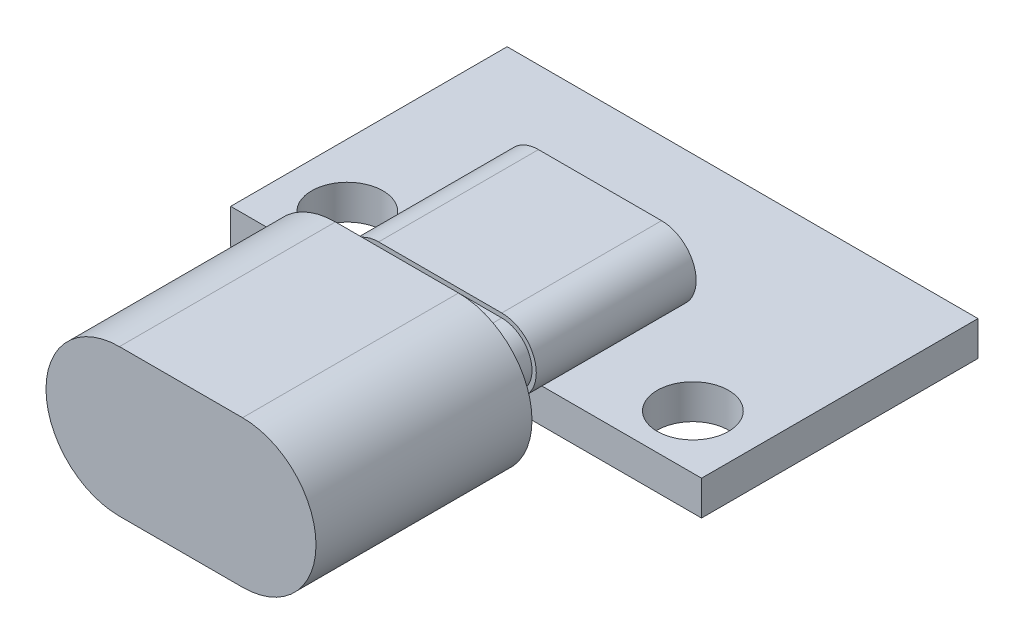
ISO-10303-21;
HEADER;
FILE_DESCRIPTION(('STEP AP214'),'2;1');
FILE_NAME('part.step','',(''),(''),'','','');
FILE_SCHEMA(('AUTOMOTIVE_DESIGN { 1 0 10303 214 1 1 1 1 }'));
ENDSEC;
DATA;
#1=APPLICATION_CONTEXT('core data for automotive mechanical design processes');
#2=APPLICATION_PROTOCOL_DEFINITION('international standard','automotive_design',2000,#1);
#3=PRODUCT_CONTEXT('',#1,'mechanical');
#4=PRODUCT('Part','Part','',(#3));
#5=PRODUCT_RELATED_PRODUCT_CATEGORY('part','',(#4));
#6=PRODUCT_DEFINITION_FORMATION('','',#4);
#7=PRODUCT_DEFINITION_CONTEXT('part definition',#1,'design');
#8=PRODUCT_DEFINITION('design','',#6,#7);
#9=PRODUCT_DEFINITION_SHAPE('','',#8);
#10=(LENGTH_UNIT() NAMED_UNIT(*) SI_UNIT(.MILLI.,.METRE.));
#11=(NAMED_UNIT(*) PLANE_ANGLE_UNIT() SI_UNIT($,.RADIAN.));
#12=(NAMED_UNIT(*) SI_UNIT($,.STERADIAN.) SOLID_ANGLE_UNIT());
#13=UNCERTAINTY_MEASURE_WITH_UNIT(LENGTH_MEASURE(1.E-05),#10,'distance_accuracy_value','');
#14=(GEOMETRIC_REPRESENTATION_CONTEXT(3) GLOBAL_UNCERTAINTY_ASSIGNED_CONTEXT((#13)) GLOBAL_UNIT_ASSIGNED_CONTEXT((#10,
#11,#12)) REPRESENTATION_CONTEXT('',''));
#15=CARTESIAN_POINT('',(0.,0.,0.));
#16=DIRECTION('',(0.,0.,1.));
#17=DIRECTION('',(1.,0.,0.));
#18=AXIS2_PLACEMENT_3D('',#15,#16,#17);
#19=CARTESIAN_POINT('',(0.,1.6,0.));
#20=DIRECTION('',(0.,-1.,0.));
#21=DIRECTION('',(0.,0.,-1.));
#22=AXIS2_PLACEMENT_3D('',#19,#20,#21);
#23=PLANE('',#22);
#24=CARTESIAN_POINT('',(8.,1.6,3.9));
#25=DIRECTION('',(0.,1.,0.));
#26=DIRECTION('',(0.,0.,1.));
#27=AXIS2_PLACEMENT_3D('',#24,#25,#26);
#28=CIRCLE('',#27,1.65);
#29=CARTESIAN_POINT('',(8.,1.6,5.55));
#30=VERTEX_POINT('',#29);
#31=EDGE_CURVE('E304',#30,#30,#28,.T.);
#32=ORIENTED_EDGE('',*,*,#31,.F.);
#33=EDGE_LOOP('',(#32));
#34=FACE_BOUND('',#33,.T.);
#35=CARTESIAN_POINT('',(-8.,1.6,3.9));
#36=DIRECTION('',(0.,1.,0.));
#37=DIRECTION('',(0.,0.,1.));
#38=AXIS2_PLACEMENT_3D('',#35,#36,#37);
#39=CIRCLE('',#38,1.65);
#40=CARTESIAN_POINT('',(-8.,1.6,5.55));
#41=VERTEX_POINT('',#40);
#42=EDGE_CURVE('E321',#41,#41,#39,.T.);
#43=ORIENTED_EDGE('',*,*,#42,.F.);
#44=EDGE_LOOP('',(#43));
#45=FACE_BOUND('',#44,.T.);
#46=DIRECTION('',(0.,0.,1.));
#47=VECTOR('',#46,1.);
#48=CARTESIAN_POINT('',(-2.85,1.6,0.2));
#49=LINE('',#48,#47);
#50=CARTESIAN_POINT('',(-2.85,1.6,0.2));
#51=VERTEX_POINT('',#50);
#52=CARTESIAN_POINT('',(-2.85,1.6,6.4));
#53=VERTEX_POINT('',#52);
#54=EDGE_CURVE('E312',#51,#53,#49,.T.);
#55=ORIENTED_EDGE('',*,*,#54,.F.);
#56=DIRECTION('',(1.,0.,0.));
#57=VECTOR('',#56,1.);
#58=CARTESIAN_POINT('',(-2.85,1.6,0.2));
#59=LINE('',#58,#57);
#60=CARTESIAN_POINT('',(2.85,1.6,0.2));
#61=VERTEX_POINT('',#60);
#62=EDGE_CURVE('E274',#51,#61,#59,.T.);
#63=ORIENTED_EDGE('',*,*,#62,.T.);
#64=DIRECTION('',(0.,0.,1.));
#65=VECTOR('',#64,1.);
#66=CARTESIAN_POINT('',(2.85,1.6,0.2));
#67=LINE('',#66,#65);
#68=CARTESIAN_POINT('',(2.85,1.6,6.4));
#69=VERTEX_POINT('',#68);
#70=EDGE_CURVE('E308',#61,#69,#67,.T.);
#71=ORIENTED_EDGE('',*,*,#70,.T.);
#72=DIRECTION('',(1.,0.,0.));
#73=VECTOR('',#72,1.);
#74=CARTESIAN_POINT('',(-10.9,1.6,6.4));
#75=LINE('',#74,#73);
#76=CARTESIAN_POINT('',(10.9,1.6,6.4));
#77=VERTEX_POINT('',#76);
#78=EDGE_CURVE('E343',#69,#77,#75,.T.);
#79=ORIENTED_EDGE('',*,*,#78,.T.);
#80=DIRECTION('',(0.,0.,-1.));
#81=VECTOR('',#80,1.);
#82=CARTESIAN_POINT('',(10.9,1.6,6.4));
#83=LINE('',#82,#81);
#84=CARTESIAN_POINT('',(10.9,1.6,-6.4));
#85=VERTEX_POINT('',#84);
#86=EDGE_CURVE('E332',#77,#85,#83,.T.);
#87=ORIENTED_EDGE('',*,*,#86,.T.);
#88=DIRECTION('',(-1.,0.,0.));
#89=VECTOR('',#88,1.);
#90=CARTESIAN_POINT('',(-10.9,1.6,-6.4));
#91=LINE('',#90,#89);
#92=CARTESIAN_POINT('',(-10.9,1.6,-6.4));
#93=VERTEX_POINT('',#92);
#94=EDGE_CURVE('E336',#85,#93,#91,.T.);
#95=ORIENTED_EDGE('',*,*,#94,.T.);
#96=DIRECTION('',(0.,0.,1.));
#97=VECTOR('',#96,1.);
#98=CARTESIAN_POINT('',(-10.9,1.6,6.4));
#99=LINE('',#98,#97);
#100=CARTESIAN_POINT('',(-10.9,1.6,6.4));
#101=VERTEX_POINT('',#100);
#102=EDGE_CURVE('E340',#93,#101,#99,.T.);
#103=ORIENTED_EDGE('',*,*,#102,.T.);
#104=EDGE_CURVE('E344',#101,#53,#75,.T.);
#105=ORIENTED_EDGE('',*,*,#104,.T.);
#106=EDGE_LOOP('',(#55,#63,#71,#79,#87,#95,#103,#105));
#107=FACE_BOUND('',#106,.T.);
#108=ADVANCED_FACE('F39',(#34,#45,#107),#23,.F.);
#109=CARTESIAN_POINT('',(10.9,1.6,6.4));
#110=DIRECTION('',(-1.,0.,0.));
#111=DIRECTION('',(0.,0.,1.));
#112=AXIS2_PLACEMENT_3D('',#109,#110,#111);
#113=PLANE('',#112);
#114=DIRECTION('',(0.,0.,-1.));
#115=VECTOR('',#114,1.);
#116=CARTESIAN_POINT('',(10.9,0.,6.4));
#117=LINE('',#116,#115);
#118=CARTESIAN_POINT('',(10.9,0.,6.4));
#119=VERTEX_POINT('',#118);
#120=CARTESIAN_POINT('',(10.9,0.,-6.4));
#121=VERTEX_POINT('',#120);
#122=EDGE_CURVE('E320',#119,#121,#117,.T.);
#123=ORIENTED_EDGE('',*,*,#122,.T.);
#124=DIRECTION('',(0.,-1.,0.));
#125=VECTOR('',#124,1.);
#126=CARTESIAN_POINT('',(10.9,1.6,-6.4));
#127=LINE('',#126,#125);
#128=EDGE_CURVE('E11',#85,#121,#127,.T.);
#129=ORIENTED_EDGE('',*,*,#128,.F.);
#130=ORIENTED_EDGE('',*,*,#86,.F.);
#131=DIRECTION('',(0.,-1.,0.));
#132=VECTOR('',#131,1.);
#133=CARTESIAN_POINT('',(10.9,1.6,6.4));
#134=LINE('',#133,#132);
#135=EDGE_CURVE('E348',#77,#119,#134,.T.);
#136=ORIENTED_EDGE('',*,*,#135,.T.);
#137=EDGE_LOOP('',(#123,#129,#130,#136));
#138=FACE_BOUND('',#137,.T.);
#139=ADVANCED_FACE('F41',(#138),#113,.F.);
#140=CARTESIAN_POINT('',(-10.9,1.6,-6.4));
#141=DIRECTION('',(0.,0.,1.));
#142=DIRECTION('',(1.,0.,0.));
#143=AXIS2_PLACEMENT_3D('',#140,#141,#142);
#144=PLANE('',#143);
#145=DIRECTION('',(-1.,0.,0.));
#146=VECTOR('',#145,1.);
#147=CARTESIAN_POINT('',(-10.9,0.,-6.4));
#148=LINE('',#147,#146);
#149=CARTESIAN_POINT('',(-10.9,0.,-6.4));
#150=VERTEX_POINT('',#149);
#151=EDGE_CURVE('E353',#121,#150,#148,.T.);
#152=ORIENTED_EDGE('',*,*,#151,.T.);
#153=DIRECTION('',(0.,-1.,0.));
#154=VECTOR('',#153,1.);
#155=CARTESIAN_POINT('',(-10.9,1.6,-6.4));
#156=LINE('',#155,#154);
#157=EDGE_CURVE('E48',#93,#150,#156,.T.);
#158=ORIENTED_EDGE('',*,*,#157,.F.);
#159=ORIENTED_EDGE('',*,*,#94,.F.);
#160=ORIENTED_EDGE('',*,*,#128,.T.);
#161=EDGE_LOOP('',(#152,#158,#159,#160));
#162=FACE_BOUND('',#161,.T.);
#163=ADVANCED_FACE('F446',(#162),#144,.F.);
#164=CARTESIAN_POINT('',(-10.9,1.6,6.4));
#165=DIRECTION('',(1.,0.,0.));
#166=DIRECTION('',(0.,0.,-1.));
#167=AXIS2_PLACEMENT_3D('',#164,#165,#166);
#168=PLANE('',#167);
#169=DIRECTION('',(0.,0.,1.));
#170=VECTOR('',#169,1.);
#171=CARTESIAN_POINT('',(-10.9,0.,6.4));
#172=LINE('',#171,#170);
#173=CARTESIAN_POINT('',(-10.9,0.,6.4));
#174=VERTEX_POINT('',#173);
#175=EDGE_CURVE('E355',#150,#174,#172,.T.);
#176=ORIENTED_EDGE('',*,*,#175,.T.);
#177=DIRECTION('',(0.,-1.,0.));
#178=VECTOR('',#177,1.);
#179=CARTESIAN_POINT('',(-10.9,1.6,6.4));
#180=LINE('',#179,#178);
#181=EDGE_CURVE('E363',#101,#174,#180,.T.);
#182=ORIENTED_EDGE('',*,*,#181,.F.);
#183=ORIENTED_EDGE('',*,*,#102,.F.);
#184=ORIENTED_EDGE('',*,*,#157,.T.);
#185=EDGE_LOOP('',(#176,#182,#183,#184));
#186=FACE_BOUND('',#185,.T.);
#187=ADVANCED_FACE('F373',(#186),#168,.F.);
#188=CARTESIAN_POINT('',(-10.9,1.6,6.4));
#189=DIRECTION('',(0.,0.,-1.));
#190=DIRECTION('',(-1.,0.,0.));
#191=AXIS2_PLACEMENT_3D('',#188,#189,#190);
#192=PLANE('',#191);
#193=DIRECTION('',(1.,0.,0.));
#194=VECTOR('',#193,1.);
#195=CARTESIAN_POINT('',(-10.9,0.,6.4));
#196=LINE('',#195,#194);
#197=EDGE_CURVE('E337',#174,#119,#196,.T.);
#198=ORIENTED_EDGE('',*,*,#197,.T.);
#199=ORIENTED_EDGE('',*,*,#135,.F.);
#200=ORIENTED_EDGE('',*,*,#78,.F.);
#201=EDGE_CURVE('E349',#53,#69,#75,.T.);
#202=ORIENTED_EDGE('',*,*,#201,.F.);
#203=ORIENTED_EDGE('',*,*,#104,.F.);
#204=ORIENTED_EDGE('',*,*,#181,.T.);
#205=EDGE_LOOP('',(#198,#199,#200,#202,#203,#204));
#206=FACE_BOUND('',#205,.T.);
#207=ADVANCED_FACE('F382',(#206),#192,.F.);
#208=CARTESIAN_POINT('',(0.,0.,0.));
#209=DIRECTION('',(0.,-1.,0.));
#210=DIRECTION('',(0.,0.,-1.));
#211=AXIS2_PLACEMENT_3D('',#208,#209,#210);
#212=PLANE('',#211);
#213=CARTESIAN_POINT('',(-8.,0.,3.9));
#214=DIRECTION('',(0.,1.,0.));
#215=DIRECTION('',(0.,0.,1.));
#216=AXIS2_PLACEMENT_3D('',#213,#214,#215);
#217=CIRCLE('',#216,1.65);
#218=CARTESIAN_POINT('',(-8.,0.,5.55));
#219=VERTEX_POINT('',#218);
#220=EDGE_CURVE('E316',#219,#219,#217,.T.);
#221=ORIENTED_EDGE('',*,*,#220,.T.);
#222=EDGE_LOOP('',(#221));
#223=FACE_BOUND('',#222,.T.);
#224=CARTESIAN_POINT('',(8.,0.,3.9));
#225=DIRECTION('',(0.,1.,0.));
#226=DIRECTION('',(0.,0.,1.));
#227=AXIS2_PLACEMENT_3D('',#224,#225,#226);
#228=CIRCLE('',#227,1.65);
#229=CARTESIAN_POINT('',(8.,0.,5.55));
#230=VERTEX_POINT('',#229);
#231=EDGE_CURVE('E325',#230,#230,#228,.T.);
#232=ORIENTED_EDGE('',*,*,#231,.T.);
#233=EDGE_LOOP('',(#232));
#234=FACE_BOUND('',#233,.T.);
#235=ORIENTED_EDGE('',*,*,#122,.F.);
#236=ORIENTED_EDGE('',*,*,#197,.F.);
#237=ORIENTED_EDGE('',*,*,#175,.F.);
#238=ORIENTED_EDGE('',*,*,#151,.F.);
#239=EDGE_LOOP('',(#235,#236,#237,#238));
#240=FACE_BOUND('',#239,.T.);
#241=ADVANCED_FACE('F379',(#223,#234,#240),#212,.T.);
#242=CARTESIAN_POINT('',(8.,0.,3.9));
#243=DIRECTION('',(0.,1.,0.));
#244=DIRECTION('',(0.,0.,1.));
#245=AXIS2_PLACEMENT_3D('',#242,#243,#244);
#246=CYLINDRICAL_SURFACE('',#245,1.65);
#247=ORIENTED_EDGE('',*,*,#231,.F.);
#248=EDGE_LOOP('',(#247));
#249=FACE_BOUND('',#248,.T.);
#250=ORIENTED_EDGE('',*,*,#31,.T.);
#251=EDGE_LOOP('',(#250));
#252=FACE_BOUND('',#251,.T.);
#253=ADVANCED_FACE('F451',(#249,#252),#246,.F.);
#254=CARTESIAN_POINT('',(-8.,0.,3.9));
#255=DIRECTION('',(0.,1.,0.));
#256=DIRECTION('',(0.,0.,1.));
#257=AXIS2_PLACEMENT_3D('',#254,#255,#256);
#258=CYLINDRICAL_SURFACE('',#257,1.65);
#259=ORIENTED_EDGE('',*,*,#220,.F.);
#260=EDGE_LOOP('',(#259));
#261=FACE_BOUND('',#260,.T.);
#262=ORIENTED_EDGE('',*,*,#42,.T.);
#263=EDGE_LOOP('',(#262));
#264=FACE_BOUND('',#263,.T.);
#265=ADVANCED_FACE('F490',(#261,#264),#258,.F.);
#266=CARTESIAN_POINT('',(-2.85,1.6,0.2));
#267=DIRECTION('',(0.,-1.,0.));
#268=DIRECTION('',(1.,0.,0.));
#269=AXIS2_PLACEMENT_3D('',#266,#267,#268);
#270=PLANE('',#269);
#271=ORIENTED_EDGE('',*,*,#201,.T.);
#272=CARTESIAN_POINT('',(2.85,1.6,7.6));
#273=VERTEX_POINT('',#272);
#274=EDGE_CURVE('E311',#69,#273,#67,.T.);
#275=ORIENTED_EDGE('',*,*,#274,.T.);
#276=DIRECTION('',(1.,0.,0.));
#277=VECTOR('',#276,1.);
#278=CARTESIAN_POINT('',(-2.85,1.6,7.6));
#279=LINE('',#278,#277);
#280=CARTESIAN_POINT('',(-2.85,1.6,7.6));
#281=VERTEX_POINT('',#280);
#282=EDGE_CURVE('E290',#281,#273,#279,.T.);
#283=ORIENTED_EDGE('',*,*,#282,.F.);
#284=EDGE_CURVE('E286',#53,#281,#49,.T.);
#285=ORIENTED_EDGE('',*,*,#284,.F.);
#286=EDGE_LOOP('',(#271,#275,#283,#285));
#287=FACE_BOUND('',#286,.T.);
#288=ADVANCED_FACE('F397',(#287),#270,.T.);
#289=CARTESIAN_POINT('',(-2.85,3.2,0.2));
#290=DIRECTION('',(0.,0.,1.));
#291=DIRECTION('',(1.,0.,0.));
#292=AXIS2_PLACEMENT_3D('',#289,#290,#291);
#293=CYLINDRICAL_SURFACE('',#292,1.6);
#294=CARTESIAN_POINT('',(-2.85,3.2,7.6));
#295=DIRECTION('',(0.,0.,1.));
#296=DIRECTION('',(1.,0.,0.));
#297=AXIS2_PLACEMENT_3D('',#294,#295,#296);
#298=CIRCLE('',#297,1.6);
#299=CARTESIAN_POINT('',(-2.85,4.8,7.6));
#300=VERTEX_POINT('',#299);
#301=EDGE_CURVE('E269',#300,#281,#298,.T.);
#302=ORIENTED_EDGE('',*,*,#301,.F.);
#303=DIRECTION('',(0.,0.,1.));
#304=VECTOR('',#303,1.);
#305=CARTESIAN_POINT('',(-2.85,4.8,0.2));
#306=LINE('',#305,#304);
#307=CARTESIAN_POINT('',(-2.85,4.8,0.2));
#308=VERTEX_POINT('',#307);
#309=EDGE_CURVE('E301',#308,#300,#306,.T.);
#310=ORIENTED_EDGE('',*,*,#309,.F.);
#311=CARTESIAN_POINT('',(-2.85,3.2,0.2));
#312=DIRECTION('',(0.,0.,1.));
#313=DIRECTION('',(1.,0.,0.));
#314=AXIS2_PLACEMENT_3D('',#311,#312,#313);
#315=CIRCLE('',#314,1.6);
#316=EDGE_CURVE('E270',#308,#51,#315,.T.);
#317=ORIENTED_EDGE('',*,*,#316,.T.);
#318=ORIENTED_EDGE('',*,*,#54,.T.);
#319=ORIENTED_EDGE('',*,*,#284,.T.);
#320=EDGE_LOOP('',(#302,#310,#317,#318,#319));
#321=FACE_BOUND('',#320,.T.);
#322=ADVANCED_FACE('F504',(#321),#293,.T.);
#323=CARTESIAN_POINT('',(-2.85,4.8,0.2));
#324=DIRECTION('',(0.,1.,0.));
#325=DIRECTION('',(-1.,0.,0.));
#326=AXIS2_PLACEMENT_3D('',#323,#324,#325);
#327=PLANE('',#326);
#328=DIRECTION('',(-1.,0.,0.));
#329=VECTOR('',#328,1.);
#330=CARTESIAN_POINT('',(-2.85,4.8,7.6));
#331=LINE('',#330,#329);
#332=CARTESIAN_POINT('',(2.85,4.8,7.6));
#333=VERTEX_POINT('',#332);
#334=EDGE_CURVE('E275',#333,#300,#331,.T.);
#335=ORIENTED_EDGE('',*,*,#334,.F.);
#336=DIRECTION('',(0.,0.,1.));
#337=VECTOR('',#336,1.);
#338=CARTESIAN_POINT('',(2.85,4.8,0.2));
#339=LINE('',#338,#337);
#340=CARTESIAN_POINT('',(2.85,4.8,0.2));
#341=VERTEX_POINT('',#340);
#342=EDGE_CURVE('E305',#341,#333,#339,.T.);
#343=ORIENTED_EDGE('',*,*,#342,.F.);
#344=DIRECTION('',(-1.,0.,0.));
#345=VECTOR('',#344,1.);
#346=CARTESIAN_POINT('',(-2.85,4.8,0.2));
#347=LINE('',#346,#345);
#348=EDGE_CURVE('E282',#341,#308,#347,.T.);
#349=ORIENTED_EDGE('',*,*,#348,.T.);
#350=ORIENTED_EDGE('',*,*,#309,.T.);
#351=EDGE_LOOP('',(#335,#343,#349,#350));
#352=FACE_BOUND('',#351,.T.);
#353=ADVANCED_FACE('F511',(#352),#327,.T.);
#354=CARTESIAN_POINT('',(2.85,3.2,0.2));
#355=DIRECTION('',(0.,0.,1.));
#356=DIRECTION('',(1.,0.,0.));
#357=AXIS2_PLACEMENT_3D('',#354,#355,#356);
#358=CYLINDRICAL_SURFACE('',#357,1.6);
#359=CARTESIAN_POINT('',(2.85,3.2,7.6));
#360=DIRECTION('',(0.,0.,1.));
#361=DIRECTION('',(1.,0.,0.));
#362=AXIS2_PLACEMENT_3D('',#359,#360,#361);
#363=CIRCLE('',#362,1.6);
#364=EDGE_CURVE('E294',#273,#333,#363,.T.);
#365=ORIENTED_EDGE('',*,*,#364,.F.);
#366=ORIENTED_EDGE('',*,*,#274,.F.);
#367=ORIENTED_EDGE('',*,*,#70,.F.);
#368=CARTESIAN_POINT('',(2.85,3.2,0.2));
#369=DIRECTION('',(0.,0.,1.));
#370=DIRECTION('',(1.,0.,0.));
#371=AXIS2_PLACEMENT_3D('',#368,#369,#370);
#372=CIRCLE('',#371,1.6);
#373=EDGE_CURVE('E278',#61,#341,#372,.T.);
#374=ORIENTED_EDGE('',*,*,#373,.T.);
#375=ORIENTED_EDGE('',*,*,#342,.T.);
#376=EDGE_LOOP('',(#365,#366,#367,#374,#375));
#377=FACE_BOUND('',#376,.T.);
#378=ADVANCED_FACE('F401',(#377),#358,.T.);
#379=CARTESIAN_POINT('',(-2.85,3.2,0.2));
#380=DIRECTION('',(0.,0.,1.));
#381=DIRECTION('',(1.,0.,0.));
#382=AXIS2_PLACEMENT_3D('',#379,#380,#381);
#383=PLANE('',#382);
#384=ORIENTED_EDGE('',*,*,#316,.F.);
#385=ORIENTED_EDGE('',*,*,#348,.F.);
#386=ORIENTED_EDGE('',*,*,#373,.F.);
#387=ORIENTED_EDGE('',*,*,#62,.F.);
#388=EDGE_LOOP('',(#384,#385,#386,#387));
#389=FACE_BOUND('',#388,.T.);
#390=ADVANCED_FACE('F527',(#389),#383,.F.);
#391=CARTESIAN_POINT('',(-2.85,3.2,7.6));
#392=DIRECTION('',(0.,0.,1.));
#393=DIRECTION('',(1.,0.,0.));
#394=AXIS2_PLACEMENT_3D('',#391,#392,#393);
#395=PLANE('',#394);
#396=CARTESIAN_POINT('',(-2.85,3.2,7.6));
#397=DIRECTION('',(0.,0.,1.));
#398=DIRECTION('',(1.,0.,0.));
#399=AXIS2_PLACEMENT_3D('',#396,#397,#398);
#400=CIRCLE('',#399,1.4);
#401=CARTESIAN_POINT('',(-2.85,4.6,7.6));
#402=VERTEX_POINT('',#401);
#403=CARTESIAN_POINT('',(-2.85,1.8,7.6));
#404=VERTEX_POINT('',#403);
#405=EDGE_CURVE('E58',#402,#404,#400,.T.);
#406=ORIENTED_EDGE('',*,*,#405,.F.);
#407=DIRECTION('',(-1.,0.,0.));
#408=VECTOR('',#407,1.);
#409=CARTESIAN_POINT('',(2.85,4.6,7.6));
#410=LINE('',#409,#408);
#411=CARTESIAN_POINT('',(2.85,4.6,7.6));
#412=VERTEX_POINT('',#411);
#413=EDGE_CURVE('E65',#412,#402,#410,.T.);
#414=ORIENTED_EDGE('',*,*,#413,.F.);
#415=CARTESIAN_POINT('',(2.85,3.2,7.6));
#416=DIRECTION('',(0.,0.,1.));
#417=DIRECTION('',(1.,0.,0.));
#418=AXIS2_PLACEMENT_3D('',#415,#416,#417);
#419=CIRCLE('',#418,1.4);
#420=CARTESIAN_POINT('',(2.85,1.8,7.6));
#421=VERTEX_POINT('',#420);
#422=EDGE_CURVE('E249',#421,#412,#419,.T.);
#423=ORIENTED_EDGE('',*,*,#422,.F.);
#424=DIRECTION('',(1.,0.,0.));
#425=VECTOR('',#424,1.);
#426=CARTESIAN_POINT('',(-2.85,1.8,7.6));
#427=LINE('',#426,#425);
#428=EDGE_CURVE('E222',#404,#421,#427,.T.);
#429=ORIENTED_EDGE('',*,*,#428,.F.);
#430=EDGE_LOOP('',(#406,#414,#423,#429));
#431=FACE_BOUND('',#430,.T.);
#432=ORIENTED_EDGE('',*,*,#301,.T.);
#433=ORIENTED_EDGE('',*,*,#282,.T.);
#434=ORIENTED_EDGE('',*,*,#364,.T.);
#435=ORIENTED_EDGE('',*,*,#334,.T.);
#436=EDGE_LOOP('',(#432,#433,#434,#435));
#437=FACE_BOUND('',#436,.T.);
#438=ADVANCED_FACE('F534',(#431,#437),#395,.T.);
#439=CARTESIAN_POINT('',(-2.85,3.2,9.6));
#440=DIRECTION('',(0.,0.,-1.));
#441=DIRECTION('',(-1.,0.,0.));
#442=AXIS2_PLACEMENT_3D('',#439,#440,#441);
#443=CYLINDRICAL_SURFACE('',#442,1.4);
#444=ORIENTED_EDGE('',*,*,#405,.T.);
#445=DIRECTION('',(0.,0.,-1.));
#446=VECTOR('',#445,1.);
#447=CARTESIAN_POINT('',(-2.85,1.8,9.6));
#448=LINE('',#447,#446);
#449=CARTESIAN_POINT('',(-2.85,1.8,9.6));
#450=VERTEX_POINT('',#449);
#451=EDGE_CURVE('E265',#450,#404,#448,.T.);
#452=ORIENTED_EDGE('',*,*,#451,.F.);
#453=CARTESIAN_POINT('',(-2.85,3.2,9.6));
#454=DIRECTION('',(0.,0.,1.));
#455=DIRECTION('',(1.,0.,0.));
#456=AXIS2_PLACEMENT_3D('',#453,#454,#455);
#457=CIRCLE('',#456,1.4);
#458=CARTESIAN_POINT('',(-2.85,4.6,9.6));
#459=VERTEX_POINT('',#458);
#460=EDGE_CURVE('E229',#459,#450,#457,.T.);
#461=ORIENTED_EDGE('',*,*,#460,.F.);
#462=DIRECTION('',(0.,0.,-1.));
#463=VECTOR('',#462,1.);
#464=CARTESIAN_POINT('',(-2.85,4.6,9.6));
#465=LINE('',#464,#463);
#466=EDGE_CURVE('E244',#459,#402,#465,.T.);
#467=ORIENTED_EDGE('',*,*,#466,.T.);
#468=EDGE_LOOP('',(#444,#452,#461,#467));
#469=FACE_BOUND('',#468,.T.);
#470=ADVANCED_FACE('F542',(#469),#443,.T.);
#471=CARTESIAN_POINT('',(-2.85,1.8,9.6));
#472=DIRECTION('',(0.,1.,0.));
#473=DIRECTION('',(0.,0.,1.));
#474=AXIS2_PLACEMENT_3D('',#471,#472,#473);
#475=PLANE('',#474);
#476=ORIENTED_EDGE('',*,*,#428,.T.);
#477=DIRECTION('',(0.,0.,-1.));
#478=VECTOR('',#477,1.);
#479=CARTESIAN_POINT('',(2.85,1.8,9.6));
#480=LINE('',#479,#478);
#481=CARTESIAN_POINT('',(2.85,1.8,9.6));
#482=VERTEX_POINT('',#481);
#483=EDGE_CURVE('E261',#482,#421,#480,.T.);
#484=ORIENTED_EDGE('',*,*,#483,.F.);
#485=DIRECTION('',(1.,0.,0.));
#486=VECTOR('',#485,1.);
#487=CARTESIAN_POINT('',(-2.85,1.8,9.6));
#488=LINE('',#487,#486);
#489=EDGE_CURVE('E233',#450,#482,#488,.T.);
#490=ORIENTED_EDGE('',*,*,#489,.F.);
#491=ORIENTED_EDGE('',*,*,#451,.T.);
#492=EDGE_LOOP('',(#476,#484,#490,#491));
#493=FACE_BOUND('',#492,.T.);
#494=ADVANCED_FACE('F550',(#493),#475,.F.);
#495=CARTESIAN_POINT('',(2.85,3.2,9.6));
#496=DIRECTION('',(0.,0.,-1.));
#497=DIRECTION('',(-1.,0.,0.));
#498=AXIS2_PLACEMENT_3D('',#495,#496,#497);
#499=CYLINDRICAL_SURFACE('',#498,1.4);
#500=ORIENTED_EDGE('',*,*,#422,.T.);
#501=DIRECTION('',(0.,0.,-1.));
#502=VECTOR('',#501,1.);
#503=CARTESIAN_POINT('',(2.85,4.6,9.6));
#504=LINE('',#503,#502);
#505=CARTESIAN_POINT('',(2.85,4.6,9.6));
#506=VERTEX_POINT('',#505);
#507=EDGE_CURVE('E257',#506,#412,#504,.T.);
#508=ORIENTED_EDGE('',*,*,#507,.F.);
#509=CARTESIAN_POINT('',(2.85,3.2,9.6));
#510=DIRECTION('',(0.,0.,1.));
#511=DIRECTION('',(1.,0.,0.));
#512=AXIS2_PLACEMENT_3D('',#509,#510,#511);
#513=CIRCLE('',#512,1.4);
#514=EDGE_CURVE('E237',#482,#506,#513,.T.);
#515=ORIENTED_EDGE('',*,*,#514,.F.);
#516=ORIENTED_EDGE('',*,*,#483,.T.);
#517=EDGE_LOOP('',(#500,#508,#515,#516));
#518=FACE_BOUND('',#517,.T.);
#519=ADVANCED_FACE('F560',(#518),#499,.T.);
#520=CARTESIAN_POINT('',(2.85,4.6,9.6));
#521=DIRECTION('',(0.,-1.,0.));
#522=DIRECTION('',(1.,0.,0.));
#523=AXIS2_PLACEMENT_3D('',#520,#521,#522);
#524=PLANE('',#523);
#525=ORIENTED_EDGE('',*,*,#413,.T.);
#526=ORIENTED_EDGE('',*,*,#466,.F.);
#527=DIRECTION('',(-1.,0.,0.));
#528=VECTOR('',#527,1.);
#529=CARTESIAN_POINT('',(2.85,4.6,9.6));
#530=LINE('',#529,#528);
#531=EDGE_CURVE('E241',#506,#459,#530,.T.);
#532=ORIENTED_EDGE('',*,*,#531,.F.);
#533=ORIENTED_EDGE('',*,*,#507,.T.);
#534=EDGE_LOOP('',(#525,#526,#532,#533));
#535=FACE_BOUND('',#534,.T.);
#536=ADVANCED_FACE('F570',(#535),#524,.F.);
#537=CARTESIAN_POINT('',(-2.85,3.2,9.6));
#538=DIRECTION('',(0.,0.,1.));
#539=DIRECTION('',(1.,0.,0.));
#540=AXIS2_PLACEMENT_3D('',#537,#538,#539);
#541=PLANE('',#540);
#542=CARTESIAN_POINT('',(-2.85,3.2,9.6));
#543=DIRECTION('',(0.,0.,1.));
#544=DIRECTION('',(1.,0.,0.));
#545=AXIS2_PLACEMENT_3D('',#542,#543,#544);
#546=CIRCLE('',#545,3.4);
#547=CARTESIAN_POINT('',(-2.85,6.6,9.6));
#548=VERTEX_POINT('',#547);
#549=CARTESIAN_POINT('',(-2.85,-0.2,9.6));
#550=VERTEX_POINT('',#549);
#551=EDGE_CURVE('E216',#548,#550,#546,.T.);
#552=ORIENTED_EDGE('',*,*,#551,.F.);
#553=DIRECTION('',(-1.,0.,0.));
#554=VECTOR('',#553,1.);
#555=CARTESIAN_POINT('',(2.85,6.6,9.6));
#556=LINE('',#555,#554);
#557=CARTESIAN_POINT('',(2.85,6.6,9.6));
#558=VERTEX_POINT('',#557);
#559=EDGE_CURVE('E212',#558,#548,#556,.T.);
#560=ORIENTED_EDGE('',*,*,#559,.F.);
#561=CARTESIAN_POINT('',(2.85,3.2,9.6));
#562=DIRECTION('',(0.,0.,1.));
#563=DIRECTION('',(1.,0.,0.));
#564=AXIS2_PLACEMENT_3D('',#561,#562,#563);
#565=CIRCLE('',#564,3.4);
#566=CARTESIAN_POINT('',(2.85,-0.2,9.6));
#567=VERTEX_POINT('',#566);
#568=EDGE_CURVE('E405',#567,#558,#565,.T.);
#569=ORIENTED_EDGE('',*,*,#568,.F.);
#570=DIRECTION('',(1.,0.,0.));
#571=VECTOR('',#570,1.);
#572=CARTESIAN_POINT('',(-2.85,-0.2,9.6));
#573=LINE('',#572,#571);
#574=EDGE_CURVE('E406',#550,#567,#573,.T.);
#575=ORIENTED_EDGE('',*,*,#574,.F.);
#576=EDGE_LOOP('',(#552,#560,#569,#575));
#577=FACE_BOUND('',#576,.T.);
#578=ORIENTED_EDGE('',*,*,#531,.T.);
#579=ORIENTED_EDGE('',*,*,#460,.T.);
#580=ORIENTED_EDGE('',*,*,#489,.T.);
#581=ORIENTED_EDGE('',*,*,#514,.T.);
#582=EDGE_LOOP('',(#578,#579,#580,#581));
#583=FACE_BOUND('',#582,.T.);
#584=ADVANCED_FACE('F428',(#577,#583),#541,.F.);
#585=CARTESIAN_POINT('',(-2.85,3.2,19.6));
#586=DIRECTION('',(0.,0.,-1.));
#587=DIRECTION('',(-1.,0.,0.));
#588=AXIS2_PLACEMENT_3D('',#585,#586,#587);
#589=CYLINDRICAL_SURFACE('',#588,3.4);
#590=ORIENTED_EDGE('',*,*,#551,.T.);
#591=DIRECTION('',(0.,0.,-1.));
#592=VECTOR('',#591,1.);
#593=CARTESIAN_POINT('',(-2.85,-0.2,19.6));
#594=LINE('',#593,#592);
#595=CARTESIAN_POINT('',(-2.85,-0.2,19.6));
#596=VERTEX_POINT('',#595);
#597=EDGE_CURVE('E194',#596,#550,#594,.T.);
#598=ORIENTED_EDGE('',*,*,#597,.F.);
#599=CARTESIAN_POINT('',(-2.85,3.2,19.6));
#600=DIRECTION('',(0.,0.,1.));
#601=DIRECTION('',(1.,0.,0.));
#602=AXIS2_PLACEMENT_3D('',#599,#600,#601);
#603=CIRCLE('',#602,3.4);
#604=CARTESIAN_POINT('',(-2.85,6.6,19.6));
#605=VERTEX_POINT('',#604);
#606=EDGE_CURVE('E202',#605,#596,#603,.T.);
#607=ORIENTED_EDGE('',*,*,#606,.F.);
#608=DIRECTION('',(0.,0.,-1.));
#609=VECTOR('',#608,1.);
#610=CARTESIAN_POINT('',(-2.85,6.6,19.6));
#611=LINE('',#610,#609);
#612=EDGE_CURVE('E416',#605,#548,#611,.T.);
#613=ORIENTED_EDGE('',*,*,#612,.T.);
#614=EDGE_LOOP('',(#590,#598,#607,#613));
#615=FACE_BOUND('',#614,.T.);
#616=ADVANCED_FACE('F214',(#615),#589,.T.);
#617=CARTESIAN_POINT('',(-2.85,-0.2,19.6));
#618=DIRECTION('',(0.,1.,0.));
#619=DIRECTION('',(-1.,0.,0.));
#620=AXIS2_PLACEMENT_3D('',#617,#618,#619);
#621=PLANE('',#620);
#622=ORIENTED_EDGE('',*,*,#574,.T.);
#623=DIRECTION('',(0.,0.,-1.));
#624=VECTOR('',#623,1.);
#625=CARTESIAN_POINT('',(2.85,-0.2,19.6));
#626=LINE('',#625,#624);
#627=CARTESIAN_POINT('',(2.85,-0.2,19.6));
#628=VERTEX_POINT('',#627);
#629=EDGE_CURVE('E197',#628,#567,#626,.T.);
#630=ORIENTED_EDGE('',*,*,#629,.F.);
#631=DIRECTION('',(1.,0.,0.));
#632=VECTOR('',#631,1.);
#633=CARTESIAN_POINT('',(-2.85,-0.2,19.6));
#634=LINE('',#633,#632);
#635=EDGE_CURVE('E190',#596,#628,#634,.T.);
#636=ORIENTED_EDGE('',*,*,#635,.F.);
#637=ORIENTED_EDGE('',*,*,#597,.T.);
#638=EDGE_LOOP('',(#622,#630,#636,#637));
#639=FACE_BOUND('',#638,.T.);
#640=ADVANCED_FACE('F192',(#639),#621,.F.);
#641=CARTESIAN_POINT('',(2.85,3.2,19.6));
#642=DIRECTION('',(0.,0.,-1.));
#643=DIRECTION('',(-1.,0.,0.));
#644=AXIS2_PLACEMENT_3D('',#641,#642,#643);
#645=CYLINDRICAL_SURFACE('',#644,3.4);
#646=ORIENTED_EDGE('',*,*,#568,.T.);
#647=DIRECTION('',(0.,0.,-1.));
#648=VECTOR('',#647,1.);
#649=CARTESIAN_POINT('',(2.85,6.6,19.6));
#650=LINE('',#649,#648);
#651=CARTESIAN_POINT('',(2.85,6.6,19.6));
#652=VERTEX_POINT('',#651);
#653=EDGE_CURVE('E225',#652,#558,#650,.T.);
#654=ORIENTED_EDGE('',*,*,#653,.F.);
#655=CARTESIAN_POINT('',(2.85,3.2,19.6));
#656=DIRECTION('',(0.,0.,1.));
#657=DIRECTION('',(1.,0.,0.));
#658=AXIS2_PLACEMENT_3D('',#655,#656,#657);
#659=CIRCLE('',#658,3.4);
#660=EDGE_CURVE('E201',#628,#652,#659,.T.);
#661=ORIENTED_EDGE('',*,*,#660,.F.);
#662=ORIENTED_EDGE('',*,*,#629,.T.);
#663=EDGE_LOOP('',(#646,#654,#661,#662));
#664=FACE_BOUND('',#663,.T.);
#665=ADVANCED_FACE('F430',(#664),#645,.T.);
#666=CARTESIAN_POINT('',(2.85,6.6,19.6));
#667=DIRECTION('',(0.,-1.,0.));
#668=DIRECTION('',(1.,0.,0.));
#669=AXIS2_PLACEMENT_3D('',#666,#667,#668);
#670=PLANE('',#669);
#671=ORIENTED_EDGE('',*,*,#559,.T.);
#672=ORIENTED_EDGE('',*,*,#612,.F.);
#673=DIRECTION('',(-1.,0.,0.));
#674=VECTOR('',#673,1.);
#675=CARTESIAN_POINT('',(2.85,6.6,19.6));
#676=LINE('',#675,#674);
#677=EDGE_CURVE('E207',#652,#605,#676,.T.);
#678=ORIENTED_EDGE('',*,*,#677,.F.);
#679=ORIENTED_EDGE('',*,*,#653,.T.);
#680=EDGE_LOOP('',(#671,#672,#678,#679));
#681=FACE_BOUND('',#680,.T.);
#682=ADVANCED_FACE('F424',(#681),#670,.F.);
#683=CARTESIAN_POINT('',(-2.85,3.2,19.6));
#684=DIRECTION('',(0.,0.,1.));
#685=DIRECTION('',(1.,0.,0.));
#686=AXIS2_PLACEMENT_3D('',#683,#684,#685);
#687=PLANE('',#686);
#688=ORIENTED_EDGE('',*,*,#606,.T.);
#689=ORIENTED_EDGE('',*,*,#635,.T.);
#690=ORIENTED_EDGE('',*,*,#660,.T.);
#691=ORIENTED_EDGE('',*,*,#677,.T.);
#692=EDGE_LOOP('',(#688,#689,#690,#691));
#693=FACE_BOUND('',#692,.T.);
#694=ADVANCED_FACE('F205',(#693),#687,.T.);
#695=CLOSED_SHELL('',(#108,#139,#163,#187,#207,#241,#253,#265,#288,#322,#353,#378,#390,#438,
#470,#494,#519,#536,#584,#616,#640,#665,#682,#694));
#696=MANIFOLD_SOLID_BREP('B2',#695);
#697=ADVANCED_BREP_SHAPE_REPRESENTATION('',(#18,#696),#14);
#698=SHAPE_DEFINITION_REPRESENTATION(#9,#697);
ENDSEC;
END-ISO-10303-21;
